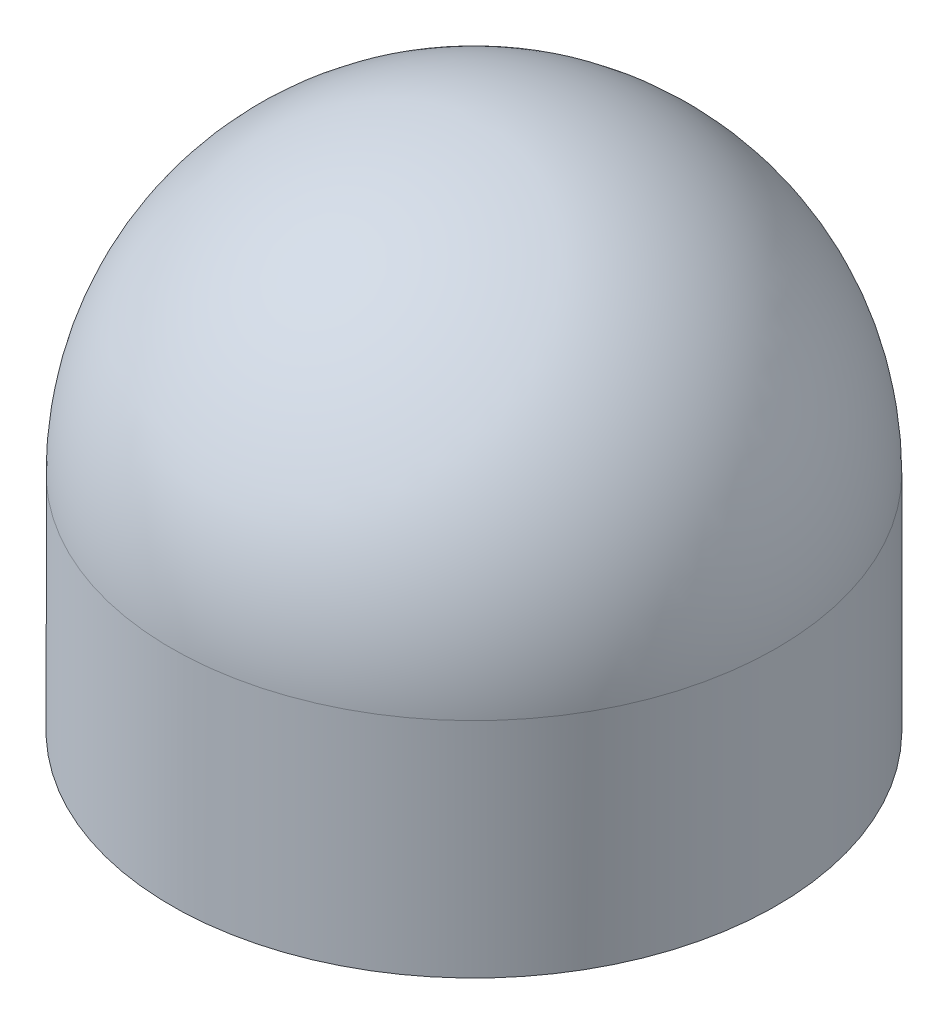
ISO-10303-21;
HEADER;
FILE_DESCRIPTION(('STEP AP214'),'2;1');
FILE_NAME('part.step','',(''),(''),'','','');
FILE_SCHEMA(('AUTOMOTIVE_DESIGN { 1 0 10303 214 1 1 1 1 }'));
ENDSEC;
DATA;
#1=APPLICATION_CONTEXT('core data for automotive mechanical design processes');
#2=APPLICATION_PROTOCOL_DEFINITION('international standard','automotive_design',2000,#1);
#3=PRODUCT_CONTEXT('',#1,'mechanical');
#4=PRODUCT('Part','Part','',(#3));
#5=PRODUCT_RELATED_PRODUCT_CATEGORY('part','',(#4));
#6=PRODUCT_DEFINITION_FORMATION('','',#4);
#7=PRODUCT_DEFINITION_CONTEXT('part definition',#1,'design');
#8=PRODUCT_DEFINITION('design','',#6,#7);
#9=PRODUCT_DEFINITION_SHAPE('','',#8);
#10=(LENGTH_UNIT() NAMED_UNIT(*) SI_UNIT(.MILLI.,.METRE.));
#11=(NAMED_UNIT(*) PLANE_ANGLE_UNIT() SI_UNIT($,.RADIAN.));
#12=(NAMED_UNIT(*) SI_UNIT($,.STERADIAN.) SOLID_ANGLE_UNIT());
#13=UNCERTAINTY_MEASURE_WITH_UNIT(LENGTH_MEASURE(1.E-05),#10,'distance_accuracy_value','');
#14=(GEOMETRIC_REPRESENTATION_CONTEXT(3) GLOBAL_UNCERTAINTY_ASSIGNED_CONTEXT((#13)) GLOBAL_UNIT_ASSIGNED_CONTEXT((#10,
#11,#12)) REPRESENTATION_CONTEXT('',''));
#15=CARTESIAN_POINT('',(0.,0.,0.));
#16=DIRECTION('',(0.,0.,1.));
#17=DIRECTION('',(1.,0.,0.));
#18=AXIS2_PLACEMENT_3D('',#15,#16,#17);
#19=CARTESIAN_POINT('',(0.,0.,0.));
#20=DIRECTION('',(0.,-1.,0.));
#21=DIRECTION('',(0.,0.,-1.));
#22=AXIS2_PLACEMENT_3D('',#19,#20,#21);
#23=PLANE('',#22);
#24=CARTESIAN_POINT('',(0.,0.,0.));
#25=DIRECTION('',(0.,-1.,0.));
#26=DIRECTION('',(0.,0.,-1.));
#27=AXIS2_PLACEMENT_3D('',#24,#25,#26);
#28=CIRCLE('',#27,4.75);
#29=CARTESIAN_POINT('',(0.,0.,-4.75));
#30=VERTEX_POINT('',#29);
#31=EDGE_CURVE('E10',#30,#30,#28,.T.);
#32=ORIENTED_EDGE('',*,*,#31,.T.);
#33=EDGE_LOOP('',(#32));
#34=FACE_BOUND('',#33,.T.);
#35=ADVANCED_FACE('F31',(#34),#23,.T.);
#36=CARTESIAN_POINT('',(0.,0.,0.));
#37=DIRECTION('',(0.,-1.,0.));
#38=DIRECTION('',(0.,0.,-1.));
#39=AXIS2_PLACEMENT_3D('',#36,#37,#38);
#40=CYLINDRICAL_SURFACE('',#39,4.75);
#41=CARTESIAN_POINT('',(0.,3.5,0.));
#42=DIRECTION('',(0.,-1.,0.));
#43=DIRECTION('',(0.,0.,-1.));
#44=AXIS2_PLACEMENT_3D('',#41,#42,#43);
#45=CIRCLE('',#44,4.75);
#46=CARTESIAN_POINT('',(0.,3.5,-4.75));
#47=VERTEX_POINT('',#46);
#48=EDGE_CURVE('E37',#47,#47,#45,.T.);
#49=ORIENTED_EDGE('',*,*,#48,.T.);
#50=EDGE_LOOP('',(#49));
#51=FACE_BOUND('',#50,.T.);
#52=ORIENTED_EDGE('',*,*,#31,.F.);
#53=EDGE_LOOP('',(#52));
#54=FACE_BOUND('',#53,.T.);
#55=ADVANCED_FACE('F43',(#51,#54),#40,.T.);
#56=CARTESIAN_POINT('',(0.,3.5,0.));
#57=DIRECTION('',(0.,-1.,0.));
#58=DIRECTION('',(1.,0.,0.));
#59=AXIS2_PLACEMENT_3D('',#56,#57,#58);
#60=SPHERICAL_SURFACE('',#59,4.75);
#61=ORIENTED_EDGE('',*,*,#48,.F.);
#62=EDGE_LOOP('',(#61));
#63=FACE_BOUND('',#62,.T.);
#64=ADVANCED_FACE('F46',(#63),#60,.T.);
#65=CLOSED_SHELL('',(#35,#55,#64));
#66=MANIFOLD_SOLID_BREP('B2',#65);
#67=ADVANCED_BREP_SHAPE_REPRESENTATION('',(#18,#66),#14);
#68=SHAPE_DEFINITION_REPRESENTATION(#9,#67);
ENDSEC;
END-ISO-10303-21;
